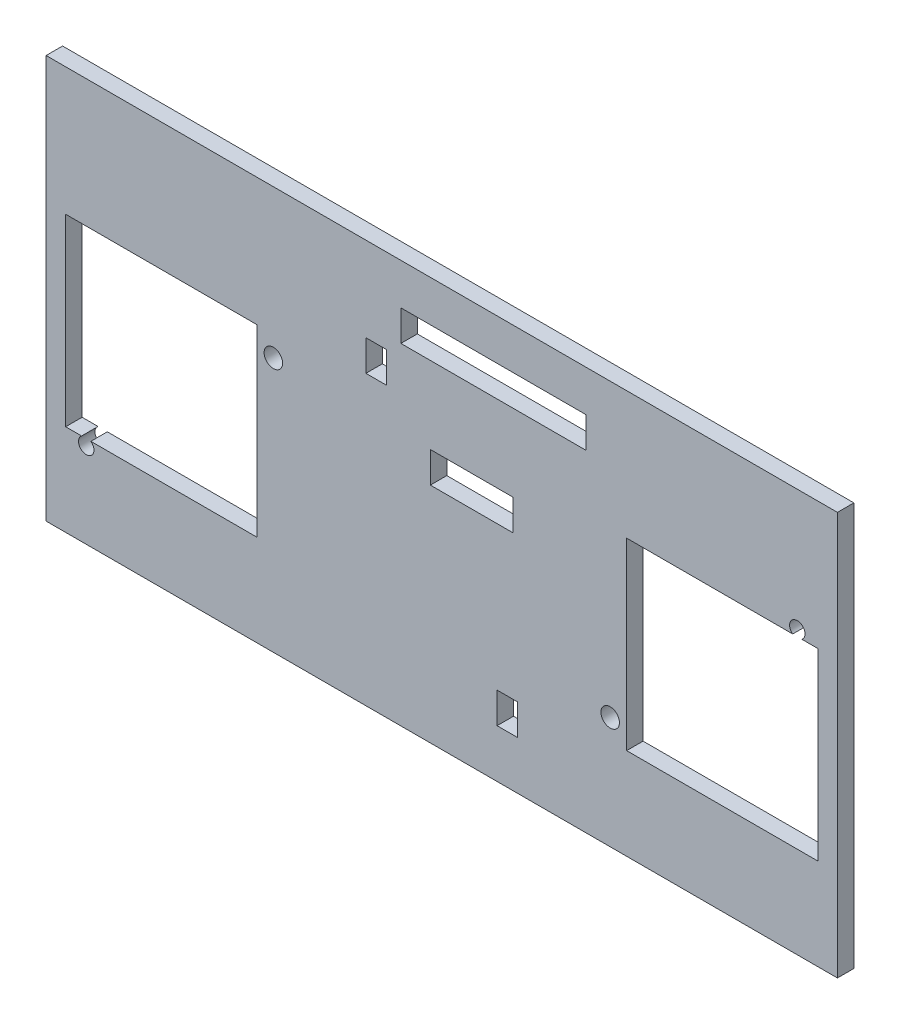
ISO-10303-21;
HEADER;
FILE_DESCRIPTION(('STEP AP214'),'2;1');
FILE_NAME('part.step','',(''),(''),'','','');
FILE_SCHEMA(('AUTOMOTIVE_DESIGN { 1 0 10303 214 1 1 1 1 }'));
ENDSEC;
DATA;
#1=APPLICATION_CONTEXT('core data for automotive mechanical design processes');
#2=APPLICATION_PROTOCOL_DEFINITION('international standard','automotive_design',2000,#1);
#3=PRODUCT_CONTEXT('',#1,'mechanical');
#4=PRODUCT('Part','Part','',(#3));
#5=PRODUCT_RELATED_PRODUCT_CATEGORY('part','',(#4));
#6=PRODUCT_DEFINITION_FORMATION('','',#4);
#7=PRODUCT_DEFINITION_CONTEXT('part definition',#1,'design');
#8=PRODUCT_DEFINITION('design','',#6,#7);
#9=PRODUCT_DEFINITION_SHAPE('','',#8);
#10=(LENGTH_UNIT() NAMED_UNIT(*) SI_UNIT(.MILLI.,.METRE.));
#11=(NAMED_UNIT(*) PLANE_ANGLE_UNIT() SI_UNIT($,.RADIAN.));
#12=(NAMED_UNIT(*) SI_UNIT($,.STERADIAN.) SOLID_ANGLE_UNIT());
#13=UNCERTAINTY_MEASURE_WITH_UNIT(LENGTH_MEASURE(1.E-05),#10,'distance_accuracy_value','');
#14=(GEOMETRIC_REPRESENTATION_CONTEXT(3) GLOBAL_UNCERTAINTY_ASSIGNED_CONTEXT((#13)) GLOBAL_UNIT_ASSIGNED_CONTEXT((#10,
#11,#12)) REPRESENTATION_CONTEXT('',''));
#15=CARTESIAN_POINT('',(0.,0.,0.));
#16=DIRECTION('',(0.,0.,1.));
#17=DIRECTION('',(1.,0.,0.));
#18=AXIS2_PLACEMENT_3D('',#15,#16,#17);
#19=CARTESIAN_POINT('',(-36.58,-9.71,1.6));
#20=DIRECTION('',(0.,1.,0.));
#21=DIRECTION('',(0.,0.,1.));
#22=AXIS2_PLACEMENT_3D('',#19,#20,#21);
#23=PLANE('',#22);
#24=DIRECTION('',(0.,0.,1.));
#25=VECTOR('',#24,1.);
#26=CARTESIAN_POINT('',(-35.03,-9.71,0.));
#27=LINE('',#26,#25);
#28=CARTESIAN_POINT('',(-35.03,-9.71,0.));
#29=VERTEX_POINT('',#28);
#30=CARTESIAN_POINT('',(-35.03,-9.71,1.6));
#31=VERTEX_POINT('',#30);
#32=EDGE_CURVE('E500',#29,#31,#27,.T.);
#33=ORIENTED_EDGE('',*,*,#32,.F.);
#34=DIRECTION('',(1.,0.,0.));
#35=VECTOR('',#34,1.);
#36=CARTESIAN_POINT('',(-36.58,-9.71,0.));
#37=LINE('',#36,#35);
#38=CARTESIAN_POINT('',(-36.58,-9.71,0.));
#39=VERTEX_POINT('',#38);
#40=EDGE_CURVE('E415',#39,#29,#37,.T.);
#41=ORIENTED_EDGE('',*,*,#40,.F.);
#42=DIRECTION('',(0.,0.,-1.));
#43=VECTOR('',#42,1.);
#44=CARTESIAN_POINT('',(-36.58,-9.71,1.6));
#45=LINE('',#44,#43);
#46=CARTESIAN_POINT('',(-36.58,-9.71,1.6));
#47=VERTEX_POINT('',#46);
#48=EDGE_CURVE('E430',#47,#39,#45,.T.);
#49=ORIENTED_EDGE('',*,*,#48,.F.);
#50=DIRECTION('',(1.,0.,0.));
#51=VECTOR('',#50,1.);
#52=CARTESIAN_POINT('',(-36.58,-9.71,1.6));
#53=LINE('',#52,#51);
#54=EDGE_CURVE('E403',#47,#31,#53,.T.);
#55=ORIENTED_EDGE('',*,*,#54,.T.);
#56=EDGE_LOOP('',(#33,#41,#49,#55));
#57=FACE_BOUND('',#56,.T.);
#58=ADVANCED_FACE('F41',(#57),#23,.T.);
#59=CARTESIAN_POINT('',(17.9799999999997,8.18999999999984,1.6));
#60=DIRECTION('',(0.,-1.,0.));
#61=DIRECTION('',(0.,0.,-1.));
#62=AXIS2_PLACEMENT_3D('',#59,#60,#61);
#63=PLANE('',#62);
#64=DIRECTION('',(0.,0.,1.));
#65=VECTOR('',#64,1.);
#66=CARTESIAN_POINT('',(35.0300000000002,8.18999999999984,0.));
#67=LINE('',#66,#65);
#68=CARTESIAN_POINT('',(35.0300000000002,8.18999999999984,0.));
#69=VERTEX_POINT('',#68);
#70=CARTESIAN_POINT('',(35.0300000000002,8.18999999999984,1.6));
#71=VERTEX_POINT('',#70);
#72=EDGE_CURVE('E496',#69,#71,#67,.T.);
#73=ORIENTED_EDGE('',*,*,#72,.F.);
#74=DIRECTION('',(-1.,0.,0.));
#75=VECTOR('',#74,1.);
#76=CARTESIAN_POINT('',(17.9799999999997,8.18999999999984,0.));
#77=LINE('',#76,#75);
#78=CARTESIAN_POINT('',(36.5799999999999,8.18999999999984,0.));
#79=VERTEX_POINT('',#78);
#80=EDGE_CURVE('E368',#79,#69,#77,.T.);
#81=ORIENTED_EDGE('',*,*,#80,.F.);
#82=DIRECTION('',(0.,0.,-1.));
#83=VECTOR('',#82,1.);
#84=CARTESIAN_POINT('',(36.5799999999999,8.18999999999984,1.6));
#85=LINE('',#84,#83);
#86=CARTESIAN_POINT('',(36.5799999999999,8.18999999999984,1.6));
#87=VERTEX_POINT('',#86);
#88=EDGE_CURVE('E391',#87,#79,#85,.T.);
#89=ORIENTED_EDGE('',*,*,#88,.F.);
#90=DIRECTION('',(-1.,0.,0.));
#91=VECTOR('',#90,1.);
#92=CARTESIAN_POINT('',(17.9799999999997,8.18999999999984,1.6));
#93=LINE('',#92,#91);
#94=EDGE_CURVE('E374',#87,#71,#93,.T.);
#95=ORIENTED_EDGE('',*,*,#94,.T.);
#96=EDGE_LOOP('',(#73,#81,#89,#95));
#97=FACE_BOUND('',#96,.T.);
#98=ADVANCED_FACE('F527',(#97),#63,.T.);
#99=CARTESIAN_POINT('',(0.,0.,1.6));
#100=DIRECTION('',(0.,0.,1.));
#101=DIRECTION('',(1.,0.,0.));
#102=AXIS2_PLACEMENT_3D('',#99,#100,#101);
#103=PLANE('',#102);
#104=DIRECTION('',(0.,1.,0.));
#105=VECTOR('',#104,1.);
#106=CARTESIAN_POINT('',(6.94,3.11,1.6));
#107=LINE('',#106,#105);
#108=CARTESIAN_POINT('',(6.94,3.11,1.6));
#109=VERTEX_POINT('',#108);
#110=CARTESIAN_POINT('',(6.94,6.11,1.6));
#111=VERTEX_POINT('',#110);
#112=EDGE_CURVE('E56',#109,#111,#107,.T.);
#113=ORIENTED_EDGE('',*,*,#112,.F.);
#114=DIRECTION('',(1.,0.,0.));
#115=VECTOR('',#114,1.);
#116=CARTESIAN_POINT('',(6.94,3.11,1.6));
#117=LINE('',#116,#115);
#118=CARTESIAN_POINT('',(-1.10999999999999,3.11,1.6));
#119=VERTEX_POINT('',#118);
#120=EDGE_CURVE('E269',#119,#109,#117,.T.);
#121=ORIENTED_EDGE('',*,*,#120,.F.);
#122=DIRECTION('',(0.,-1.,0.));
#123=VECTOR('',#122,1.);
#124=CARTESIAN_POINT('',(-1.10999999999999,3.11,1.6));
#125=LINE('',#124,#123);
#126=CARTESIAN_POINT('',(-1.10999999999999,6.11,1.6));
#127=VERTEX_POINT('',#126);
#128=EDGE_CURVE('E253',#127,#119,#125,.T.);
#129=ORIENTED_EDGE('',*,*,#128,.F.);
#130=DIRECTION('',(-1.,0.,0.));
#131=VECTOR('',#130,1.);
#132=CARTESIAN_POINT('',(6.94,6.11,1.6));
#133=LINE('',#132,#131);
#134=EDGE_CURVE('E262',#111,#127,#133,.T.);
#135=ORIENTED_EDGE('',*,*,#134,.F.);
#136=EDGE_LOOP('',(#113,#121,#129,#135));
#137=FACE_BOUND('',#136,.T.);
#138=DIRECTION('',(0.,1.,0.));
#139=VECTOR('',#138,1.);
#140=CARTESIAN_POINT('',(7.37999999999971,-13.91,1.6));
#141=LINE('',#140,#139);
#142=CARTESIAN_POINT('',(7.37999999999971,-13.91,1.6));
#143=VERTEX_POINT('',#142);
#144=CARTESIAN_POINT('',(7.37999999999971,-10.91,1.6));
#145=VERTEX_POINT('',#144);
#146=EDGE_CURVE('E293',#143,#145,#141,.T.);
#147=ORIENTED_EDGE('',*,*,#146,.F.);
#148=DIRECTION('',(1.,0.,0.));
#149=VECTOR('',#148,1.);
#150=CARTESIAN_POINT('',(7.37999999999971,-13.91,1.6));
#151=LINE('',#150,#149);
#152=CARTESIAN_POINT('',(5.37999999999971,-13.91,1.6));
#153=VERTEX_POINT('',#152);
#154=EDGE_CURVE('E283',#153,#143,#151,.T.);
#155=ORIENTED_EDGE('',*,*,#154,.F.);
#156=DIRECTION('',(0.,-1.,0.));
#157=VECTOR('',#156,1.);
#158=CARTESIAN_POINT('',(5.37999999999971,-13.91,1.6));
#159=LINE('',#158,#157);
#160=CARTESIAN_POINT('',(5.37999999999971,-10.91,1.6));
#161=VERTEX_POINT('',#160);
#162=EDGE_CURVE('E299',#161,#153,#159,.T.);
#163=ORIENTED_EDGE('',*,*,#162,.F.);
#164=DIRECTION('',(-1.,0.,0.));
#165=VECTOR('',#164,1.);
#166=CARTESIAN_POINT('',(7.37999999999971,-10.91,1.6));
#167=LINE('',#166,#165);
#168=EDGE_CURVE('E295',#145,#161,#167,.T.);
#169=ORIENTED_EDGE('',*,*,#168,.F.);
#170=EDGE_LOOP('',(#147,#155,#163,#169));
#171=FACE_BOUND('',#170,.T.);
#172=DIRECTION('',(0.,1.,0.));
#173=VECTOR('',#172,1.);
#174=CARTESIAN_POINT('',(-5.38,9.39,1.6));
#175=LINE('',#174,#173);
#176=CARTESIAN_POINT('',(-5.38,9.39,1.6));
#177=VERTEX_POINT('',#176);
#178=CARTESIAN_POINT('',(-5.38,12.39,1.6));
#179=VERTEX_POINT('',#178);
#180=EDGE_CURVE('E296',#177,#179,#175,.T.);
#181=ORIENTED_EDGE('',*,*,#180,.F.);
#182=DIRECTION('',(1.,0.,0.));
#183=VECTOR('',#182,1.);
#184=CARTESIAN_POINT('',(-5.38,9.39,1.6));
#185=LINE('',#184,#183);
#186=CARTESIAN_POINT('',(-7.38,9.39,1.6));
#187=VERTEX_POINT('',#186);
#188=EDGE_CURVE('E322',#187,#177,#185,.T.);
#189=ORIENTED_EDGE('',*,*,#188,.F.);
#190=DIRECTION('',(0.,-1.,0.));
#191=VECTOR('',#190,1.);
#192=CARTESIAN_POINT('',(-7.38,9.39,1.6));
#193=LINE('',#192,#191);
#194=CARTESIAN_POINT('',(-7.38,12.39,1.6));
#195=VERTEX_POINT('',#194);
#196=EDGE_CURVE('E325',#195,#187,#193,.T.);
#197=ORIENTED_EDGE('',*,*,#196,.F.);
#198=DIRECTION('',(-1.,0.,0.));
#199=VECTOR('',#198,1.);
#200=CARTESIAN_POINT('',(-5.38,12.39,1.6));
#201=LINE('',#200,#199);
#202=EDGE_CURVE('E329',#179,#195,#201,.T.);
#203=ORIENTED_EDGE('',*,*,#202,.F.);
#204=EDGE_LOOP('',(#181,#189,#197,#203));
#205=FACE_BOUND('',#204,.T.);
#206=CARTESIAN_POINT('',(34.5799999999999,8.78999999999967,1.6));
#207=DIRECTION('',(0.,0.,1.));
#208=DIRECTION('',(1.,0.,0.));
#209=AXIS2_PLACEMENT_3D('',#206,#207,#208);
#210=CIRCLE('',#209,0.749999999999999);
#211=CARTESIAN_POINT('',(34.1299999999997,8.18999999999984,1.6));
#212=VERTEX_POINT('',#211);
#213=EDGE_CURVE('E347',#71,#212,#210,.T.);
#214=ORIENTED_EDGE('',*,*,#213,.F.);
#215=ORIENTED_EDGE('',*,*,#94,.F.);
#216=DIRECTION('',(0.,1.,0.));
#217=VECTOR('',#216,1.);
#218=CARTESIAN_POINT('',(36.5799999999999,8.18999999999984,1.6));
#219=LINE('',#218,#217);
#220=CARTESIAN_POINT('',(36.5799999999999,-9.71000000000036,1.6));
#221=VERTEX_POINT('',#220);
#222=EDGE_CURVE('E370',#221,#87,#219,.T.);
#223=ORIENTED_EDGE('',*,*,#222,.F.);
#224=DIRECTION('',(1.,0.,0.));
#225=VECTOR('',#224,1.);
#226=CARTESIAN_POINT('',(17.9799999999997,-9.71000000000036,1.6));
#227=LINE('',#226,#225);
#228=CARTESIAN_POINT('',(17.9799999999997,-9.71000000000036,1.6));
#229=VERTEX_POINT('',#228);
#230=EDGE_CURVE('E367',#229,#221,#227,.T.);
#231=ORIENTED_EDGE('',*,*,#230,.F.);
#232=DIRECTION('',(0.,-1.,0.));
#233=VECTOR('',#232,1.);
#234=CARTESIAN_POINT('',(17.9799999999997,8.18999999999984,1.6));
#235=LINE('',#234,#233);
#236=CARTESIAN_POINT('',(17.9799999999997,8.18999999999984,1.6));
#237=VERTEX_POINT('',#236);
#238=EDGE_CURVE('E365',#237,#229,#235,.T.);
#239=ORIENTED_EDGE('',*,*,#238,.F.);
#240=EDGE_CURVE('E373',#212,#237,#93,.T.);
#241=ORIENTED_EDGE('',*,*,#240,.F.);
#242=EDGE_LOOP('',(#214,#215,#223,#231,#239,#241));
#243=FACE_BOUND('',#242,.T.);
#244=CARTESIAN_POINT('',(-34.58,-10.31,1.6));
#245=DIRECTION('',(0.,0.,1.));
#246=DIRECTION('',(1.,0.,0.));
#247=AXIS2_PLACEMENT_3D('',#244,#245,#246);
#248=CIRCLE('',#247,0.749999999999999);
#249=CARTESIAN_POINT('',(-34.13,-9.71,1.6));
#250=VERTEX_POINT('',#249);
#251=EDGE_CURVE('E349',#31,#250,#248,.T.);
#252=ORIENTED_EDGE('',*,*,#251,.F.);
#253=ORIENTED_EDGE('',*,*,#54,.F.);
#254=DIRECTION('',(0.,-1.,0.));
#255=VECTOR('',#254,1.);
#256=CARTESIAN_POINT('',(-36.58,8.19,1.6));
#257=LINE('',#256,#255);
#258=CARTESIAN_POINT('',(-36.58,8.19,1.6));
#259=VERTEX_POINT('',#258);
#260=EDGE_CURVE('E399',#259,#47,#257,.T.);
#261=ORIENTED_EDGE('',*,*,#260,.F.);
#262=DIRECTION('',(-1.,0.,0.));
#263=VECTOR('',#262,1.);
#264=CARTESIAN_POINT('',(-36.58,8.19,1.6));
#265=LINE('',#264,#263);
#266=CARTESIAN_POINT('',(-17.98,8.19,1.6));
#267=VERTEX_POINT('',#266);
#268=EDGE_CURVE('E409',#267,#259,#265,.T.);
#269=ORIENTED_EDGE('',*,*,#268,.F.);
#270=DIRECTION('',(0.,1.,0.));
#271=VECTOR('',#270,1.);
#272=CARTESIAN_POINT('',(-17.98,8.19,1.6));
#273=LINE('',#272,#271);
#274=CARTESIAN_POINT('',(-17.98,-9.71,1.6));
#275=VERTEX_POINT('',#274);
#276=EDGE_CURVE('E406',#275,#267,#273,.T.);
#277=ORIENTED_EDGE('',*,*,#276,.F.);
#278=EDGE_CURVE('E401',#250,#275,#53,.T.);
#279=ORIENTED_EDGE('',*,*,#278,.F.);
#280=EDGE_LOOP('',(#252,#253,#261,#269,#277,#279));
#281=FACE_BOUND('',#280,.T.);
#282=CARTESIAN_POINT('',(-16.38,6.19,1.6));
#283=DIRECTION('',(0.,0.,1.));
#284=DIRECTION('',(1.,0.,0.));
#285=AXIS2_PLACEMENT_3D('',#282,#283,#284);
#286=CIRCLE('',#285,0.9);
#287=CARTESIAN_POINT('',(-15.48,6.19,1.6));
#288=VERTEX_POINT('',#287);
#289=EDGE_CURVE('E359',#288,#288,#286,.T.);
#290=ORIENTED_EDGE('',*,*,#289,.F.);
#291=EDGE_LOOP('',(#290));
#292=FACE_BOUND('',#291,.T.);
#293=DIRECTION('',(0.,1.,0.));
#294=VECTOR('',#293,1.);
#295=CARTESIAN_POINT('',(38.4799999999999,-18.61,1.6));
#296=LINE('',#295,#294);
#297=CARTESIAN_POINT('',(38.4799999999999,-18.61,1.6));
#298=VERTEX_POINT('',#297);
#299=CARTESIAN_POINT('',(38.4799999999999,20.61,1.6));
#300=VERTEX_POINT('',#299);
#301=EDGE_CURVE('E465',#298,#300,#296,.T.);
#302=ORIENTED_EDGE('',*,*,#301,.T.);
#303=DIRECTION('',(-1.,0.,0.));
#304=VECTOR('',#303,1.);
#305=CARTESIAN_POINT('',(38.4799999999999,20.61,1.6));
#306=LINE('',#305,#304);
#307=CARTESIAN_POINT('',(-38.48,20.61,1.6));
#308=VERTEX_POINT('',#307);
#309=EDGE_CURVE('E468',#300,#308,#306,.T.);
#310=ORIENTED_EDGE('',*,*,#309,.T.);
#311=DIRECTION('',(0.,-1.,0.));
#312=VECTOR('',#311,1.);
#313=CARTESIAN_POINT('',(-38.48,-18.61,1.6));
#314=LINE('',#313,#312);
#315=CARTESIAN_POINT('',(-38.48,-18.61,1.6));
#316=VERTEX_POINT('',#315);
#317=EDGE_CURVE('E471',#308,#316,#314,.T.);
#318=ORIENTED_EDGE('',*,*,#317,.T.);
#319=DIRECTION('',(1.,0.,0.));
#320=VECTOR('',#319,1.);
#321=CARTESIAN_POINT('',(38.4799999999999,-18.61,1.6));
#322=LINE('',#321,#320);
#323=EDGE_CURVE('E473',#316,#298,#322,.T.);
#324=ORIENTED_EDGE('',*,*,#323,.T.);
#325=EDGE_LOOP('',(#302,#310,#318,#324));
#326=FACE_BOUND('',#325,.T.);
#327=DIRECTION('',(1.,0.,0.));
#328=VECTOR('',#327,1.);
#329=CARTESIAN_POINT('',(-3.98,13.61,1.6));
#330=LINE('',#329,#328);
#331=CARTESIAN_POINT('',(-3.98,13.61,1.6));
#332=VERTEX_POINT('',#331);
#333=CARTESIAN_POINT('',(14.02,13.61,1.6));
#334=VERTEX_POINT('',#333);
#335=EDGE_CURVE('E436',#332,#334,#330,.T.);
#336=ORIENTED_EDGE('',*,*,#335,.F.);
#337=DIRECTION('',(0.,-1.,0.));
#338=VECTOR('',#337,1.);
#339=CARTESIAN_POINT('',(-3.98,16.61,1.6));
#340=LINE('',#339,#338);
#341=CARTESIAN_POINT('',(-3.98,16.61,1.6));
#342=VERTEX_POINT('',#341);
#343=EDGE_CURVE('E434',#342,#332,#340,.T.);
#344=ORIENTED_EDGE('',*,*,#343,.F.);
#345=DIRECTION('',(-1.,0.,0.));
#346=VECTOR('',#345,1.);
#347=CARTESIAN_POINT('',(-3.98,16.61,1.6));
#348=LINE('',#347,#346);
#349=CARTESIAN_POINT('',(14.02,16.61,1.6));
#350=VERTEX_POINT('',#349);
#351=EDGE_CURVE('E442',#350,#342,#348,.T.);
#352=ORIENTED_EDGE('',*,*,#351,.F.);
#353=DIRECTION('',(0.,1.,0.));
#354=VECTOR('',#353,1.);
#355=CARTESIAN_POINT('',(14.02,16.61,1.6));
#356=LINE('',#355,#354);
#357=EDGE_CURVE('E439',#334,#350,#356,.T.);
#358=ORIENTED_EDGE('',*,*,#357,.F.);
#359=EDGE_LOOP('',(#336,#344,#352,#358));
#360=FACE_BOUND('',#359,.T.);
#361=CARTESIAN_POINT('',(16.3799999999997,-7.71000000000014,1.6));
#362=DIRECTION('',(0.,0.,1.));
#363=DIRECTION('',(1.,0.,0.));
#364=AXIS2_PLACEMENT_3D('',#361,#362,#363);
#365=CIRCLE('',#364,0.9);
#366=CARTESIAN_POINT('',(17.2799999999997,-7.71000000000014,1.6));
#367=VERTEX_POINT('',#366);
#368=EDGE_CURVE('E353',#367,#367,#365,.T.);
#369=ORIENTED_EDGE('',*,*,#368,.F.);
#370=EDGE_LOOP('',(#369));
#371=FACE_BOUND('',#370,.T.);
#372=ADVANCED_FACE('F266',(#137,#171,#205,#243,#281,#292,#326,#360,#371),#103,.T.);
#373=CARTESIAN_POINT('',(0.,0.,0.));
#374=DIRECTION('',(0.,0.,1.));
#375=DIRECTION('',(1.,0.,0.));
#376=AXIS2_PLACEMENT_3D('',#373,#374,#375);
#377=PLANE('',#376);
#378=DIRECTION('',(1.,0.,0.));
#379=VECTOR('',#378,1.);
#380=CARTESIAN_POINT('',(0.,3.11,0.));
#381=LINE('',#380,#379);
#382=CARTESIAN_POINT('',(-1.10999999999999,3.11,0.));
#383=VERTEX_POINT('',#382);
#384=CARTESIAN_POINT('',(6.94,3.11,0.));
#385=VERTEX_POINT('',#384);
#386=EDGE_CURVE('E49',#383,#385,#381,.T.);
#387=ORIENTED_EDGE('',*,*,#386,.T.);
#388=DIRECTION('',(0.,1.,0.));
#389=VECTOR('',#388,1.);
#390=CARTESIAN_POINT('',(6.94,0.,0.));
#391=LINE('',#390,#389);
#392=CARTESIAN_POINT('',(6.94,6.11,0.));
#393=VERTEX_POINT('',#392);
#394=EDGE_CURVE('E11',#385,#393,#391,.T.);
#395=ORIENTED_EDGE('',*,*,#394,.T.);
#396=DIRECTION('',(-1.,0.,0.));
#397=VECTOR('',#396,1.);
#398=CARTESIAN_POINT('',(0.,6.11,0.));
#399=LINE('',#398,#397);
#400=CARTESIAN_POINT('',(-1.10999999999999,6.11,0.));
#401=VERTEX_POINT('',#400);
#402=EDGE_CURVE('E502',#393,#401,#399,.T.);
#403=ORIENTED_EDGE('',*,*,#402,.T.);
#404=DIRECTION('',(0.,-1.,0.));
#405=VECTOR('',#404,1.);
#406=CARTESIAN_POINT('',(-1.10999999999999,0.,0.));
#407=LINE('',#406,#405);
#408=EDGE_CURVE('E256',#401,#383,#407,.T.);
#409=ORIENTED_EDGE('',*,*,#408,.T.);
#410=EDGE_LOOP('',(#387,#395,#403,#409));
#411=FACE_BOUND('',#410,.T.);
#412=DIRECTION('',(1.,0.,0.));
#413=VECTOR('',#412,1.);
#414=CARTESIAN_POINT('',(7.37999999999971,-13.91,0.));
#415=LINE('',#414,#413);
#416=CARTESIAN_POINT('',(5.37999999999971,-13.91,0.));
#417=VERTEX_POINT('',#416);
#418=CARTESIAN_POINT('',(7.37999999999971,-13.91,0.));
#419=VERTEX_POINT('',#418);
#420=EDGE_CURVE('E289',#417,#419,#415,.T.);
#421=ORIENTED_EDGE('',*,*,#420,.T.);
#422=DIRECTION('',(0.,1.,0.));
#423=VECTOR('',#422,1.);
#424=CARTESIAN_POINT('',(7.37999999999971,-13.91,0.));
#425=LINE('',#424,#423);
#426=CARTESIAN_POINT('',(7.37999999999971,-10.91,0.));
#427=VERTEX_POINT('',#426);
#428=EDGE_CURVE('E279',#419,#427,#425,.T.);
#429=ORIENTED_EDGE('',*,*,#428,.T.);
#430=DIRECTION('',(-1.,0.,0.));
#431=VECTOR('',#430,1.);
#432=CARTESIAN_POINT('',(7.37999999999971,-10.91,0.));
#433=LINE('',#432,#431);
#434=CARTESIAN_POINT('',(5.37999999999971,-10.91,0.));
#435=VERTEX_POINT('',#434);
#436=EDGE_CURVE('E282',#427,#435,#433,.T.);
#437=ORIENTED_EDGE('',*,*,#436,.T.);
#438=DIRECTION('',(0.,-1.,0.));
#439=VECTOR('',#438,1.);
#440=CARTESIAN_POINT('',(5.37999999999971,-13.91,0.));
#441=LINE('',#440,#439);
#442=EDGE_CURVE('E286',#435,#417,#441,.T.);
#443=ORIENTED_EDGE('',*,*,#442,.T.);
#444=EDGE_LOOP('',(#421,#429,#437,#443));
#445=FACE_BOUND('',#444,.T.);
#446=DIRECTION('',(1.,0.,0.));
#447=VECTOR('',#446,1.);
#448=CARTESIAN_POINT('',(-5.38,9.39,0.));
#449=LINE('',#448,#447);
#450=CARTESIAN_POINT('',(-7.38,9.39,0.));
#451=VERTEX_POINT('',#450);
#452=CARTESIAN_POINT('',(-5.38,9.39,0.));
#453=VERTEX_POINT('',#452);
#454=EDGE_CURVE('E316',#451,#453,#449,.T.);
#455=ORIENTED_EDGE('',*,*,#454,.T.);
#456=DIRECTION('',(0.,1.,0.));
#457=VECTOR('',#456,1.);
#458=CARTESIAN_POINT('',(-5.38,9.39,0.));
#459=LINE('',#458,#457);
#460=CARTESIAN_POINT('',(-5.38,12.39,0.));
#461=VERTEX_POINT('',#460);
#462=EDGE_CURVE('E326',#453,#461,#459,.T.);
#463=ORIENTED_EDGE('',*,*,#462,.T.);
#464=DIRECTION('',(-1.,0.,0.));
#465=VECTOR('',#464,1.);
#466=CARTESIAN_POINT('',(-5.38,12.39,0.));
#467=LINE('',#466,#465);
#468=CARTESIAN_POINT('',(-7.38,12.39,0.));
#469=VERTEX_POINT('',#468);
#470=EDGE_CURVE('E338',#461,#469,#467,.T.);
#471=ORIENTED_EDGE('',*,*,#470,.T.);
#472=DIRECTION('',(0.,-1.,0.));
#473=VECTOR('',#472,1.);
#474=CARTESIAN_POINT('',(-7.38,9.39,0.));
#475=LINE('',#474,#473);
#476=EDGE_CURVE('E335',#469,#451,#475,.T.);
#477=ORIENTED_EDGE('',*,*,#476,.T.);
#478=EDGE_LOOP('',(#455,#463,#471,#477));
#479=FACE_BOUND('',#478,.T.);
#480=ORIENTED_EDGE('',*,*,#40,.T.);
#481=CARTESIAN_POINT('',(-34.58,-10.31,0.));
#482=DIRECTION('',(0.,0.,1.));
#483=DIRECTION('',(1.,0.,0.));
#484=AXIS2_PLACEMENT_3D('',#481,#482,#483);
#485=CIRCLE('',#484,0.749999999999999);
#486=CARTESIAN_POINT('',(-34.13,-9.71,0.));
#487=VERTEX_POINT('',#486);
#488=EDGE_CURVE('E306',#29,#487,#485,.T.);
#489=ORIENTED_EDGE('',*,*,#488,.T.);
#490=CARTESIAN_POINT('',(-17.98,-9.71,0.));
#491=VERTEX_POINT('',#490);
#492=EDGE_CURVE('E414',#487,#491,#37,.T.);
#493=ORIENTED_EDGE('',*,*,#492,.T.);
#494=DIRECTION('',(0.,1.,0.));
#495=VECTOR('',#494,1.);
#496=CARTESIAN_POINT('',(-17.98,8.19,0.));
#497=LINE('',#496,#495);
#498=CARTESIAN_POINT('',(-17.98,8.19,0.));
#499=VERTEX_POINT('',#498);
#500=EDGE_CURVE('E418',#491,#499,#497,.T.);
#501=ORIENTED_EDGE('',*,*,#500,.T.);
#502=DIRECTION('',(-1.,0.,0.));
#503=VECTOR('',#502,1.);
#504=CARTESIAN_POINT('',(-36.58,8.19,0.));
#505=LINE('',#504,#503);
#506=CARTESIAN_POINT('',(-36.58,8.19,0.));
#507=VERTEX_POINT('',#506);
#508=EDGE_CURVE('E402',#499,#507,#505,.T.);
#509=ORIENTED_EDGE('',*,*,#508,.T.);
#510=DIRECTION('',(0.,-1.,0.));
#511=VECTOR('',#510,1.);
#512=CARTESIAN_POINT('',(-36.58,8.19,0.));
#513=LINE('',#512,#511);
#514=EDGE_CURVE('E398',#507,#39,#513,.T.);
#515=ORIENTED_EDGE('',*,*,#514,.T.);
#516=EDGE_LOOP('',(#480,#489,#493,#501,#509,#515));
#517=FACE_BOUND('',#516,.T.);
#518=DIRECTION('',(0.,1.,0.));
#519=VECTOR('',#518,1.);
#520=CARTESIAN_POINT('',(38.4799999999999,-18.61,0.));
#521=LINE('',#520,#519);
#522=CARTESIAN_POINT('',(38.4799999999999,-18.61,0.));
#523=VERTEX_POINT('',#522);
#524=CARTESIAN_POINT('',(38.4799999999999,20.61,0.));
#525=VERTEX_POINT('',#524);
#526=EDGE_CURVE('E464',#523,#525,#521,.T.);
#527=ORIENTED_EDGE('',*,*,#526,.F.);
#528=DIRECTION('',(1.,0.,0.));
#529=VECTOR('',#528,1.);
#530=CARTESIAN_POINT('',(38.4799999999999,-18.61,0.));
#531=LINE('',#530,#529);
#532=CARTESIAN_POINT('',(-38.48,-18.61,0.));
#533=VERTEX_POINT('',#532);
#534=EDGE_CURVE('E469',#533,#523,#531,.T.);
#535=ORIENTED_EDGE('',*,*,#534,.F.);
#536=DIRECTION('',(0.,-1.,0.));
#537=VECTOR('',#536,1.);
#538=CARTESIAN_POINT('',(-38.48,-18.61,0.));
#539=LINE('',#538,#537);
#540=CARTESIAN_POINT('',(-38.48,20.61,0.));
#541=VERTEX_POINT('',#540);
#542=EDGE_CURVE('E480',#541,#533,#539,.T.);
#543=ORIENTED_EDGE('',*,*,#542,.F.);
#544=DIRECTION('',(-1.,0.,0.));
#545=VECTOR('',#544,1.);
#546=CARTESIAN_POINT('',(38.4799999999999,20.61,0.));
#547=LINE('',#546,#545);
#548=EDGE_CURVE('E478',#525,#541,#547,.T.);
#549=ORIENTED_EDGE('',*,*,#548,.F.);
#550=EDGE_LOOP('',(#527,#535,#543,#549));
#551=FACE_BOUND('',#550,.T.);
#552=DIRECTION('',(0.,-1.,0.));
#553=VECTOR('',#552,1.);
#554=CARTESIAN_POINT('',(-3.98,16.61,0.));
#555=LINE('',#554,#553);
#556=CARTESIAN_POINT('',(-3.98,16.61,0.));
#557=VERTEX_POINT('',#556);
#558=CARTESIAN_POINT('',(-3.98,13.61,0.));
#559=VERTEX_POINT('',#558);
#560=EDGE_CURVE('E433',#557,#559,#555,.T.);
#561=ORIENTED_EDGE('',*,*,#560,.T.);
#562=DIRECTION('',(1.,0.,0.));
#563=VECTOR('',#562,1.);
#564=CARTESIAN_POINT('',(-3.98,13.61,0.));
#565=LINE('',#564,#563);
#566=CARTESIAN_POINT('',(14.02,13.61,0.));
#567=VERTEX_POINT('',#566);
#568=EDGE_CURVE('E447',#559,#567,#565,.T.);
#569=ORIENTED_EDGE('',*,*,#568,.T.);
#570=DIRECTION('',(0.,1.,0.));
#571=VECTOR('',#570,1.);
#572=CARTESIAN_POINT('',(14.02,16.61,0.));
#573=LINE('',#572,#571);
#574=CARTESIAN_POINT('',(14.02,16.61,0.));
#575=VERTEX_POINT('',#574);
#576=EDGE_CURVE('E450',#567,#575,#573,.T.);
#577=ORIENTED_EDGE('',*,*,#576,.T.);
#578=DIRECTION('',(-1.,0.,0.));
#579=VECTOR('',#578,1.);
#580=CARTESIAN_POINT('',(-3.98,16.61,0.));
#581=LINE('',#580,#579);
#582=EDGE_CURVE('E437',#575,#557,#581,.T.);
#583=ORIENTED_EDGE('',*,*,#582,.T.);
#584=EDGE_LOOP('',(#561,#569,#577,#583));
#585=FACE_BOUND('',#584,.T.);
#586=ORIENTED_EDGE('',*,*,#80,.T.);
#587=CARTESIAN_POINT('',(34.5799999999999,8.78999999999967,0.));
#588=DIRECTION('',(0.,0.,1.));
#589=DIRECTION('',(1.,0.,0.));
#590=AXIS2_PLACEMENT_3D('',#587,#588,#589);
#591=CIRCLE('',#590,0.749999999999999);
#592=CARTESIAN_POINT('',(34.1299999999997,8.18999999999984,0.));
#593=VERTEX_POINT('',#592);
#594=EDGE_CURVE('E343',#69,#593,#591,.T.);
#595=ORIENTED_EDGE('',*,*,#594,.T.);
#596=CARTESIAN_POINT('',(17.9799999999997,8.18999999999984,0.));
#597=VERTEX_POINT('',#596);
#598=EDGE_CURVE('E386',#593,#597,#77,.T.);
#599=ORIENTED_EDGE('',*,*,#598,.T.);
#600=DIRECTION('',(0.,-1.,0.));
#601=VECTOR('',#600,1.);
#602=CARTESIAN_POINT('',(17.9799999999997,8.18999999999984,0.));
#603=LINE('',#602,#601);
#604=CARTESIAN_POINT('',(17.9799999999997,-9.71000000000036,0.));
#605=VERTEX_POINT('',#604);
#606=EDGE_CURVE('E362',#597,#605,#603,.T.);
#607=ORIENTED_EDGE('',*,*,#606,.T.);
#608=DIRECTION('',(1.,0.,0.));
#609=VECTOR('',#608,1.);
#610=CARTESIAN_POINT('',(17.9799999999997,-9.71000000000036,0.));
#611=LINE('',#610,#609);
#612=CARTESIAN_POINT('',(36.5799999999999,-9.71000000000036,0.));
#613=VERTEX_POINT('',#612);
#614=EDGE_CURVE('E380',#605,#613,#611,.T.);
#615=ORIENTED_EDGE('',*,*,#614,.T.);
#616=DIRECTION('',(0.,1.,0.));
#617=VECTOR('',#616,1.);
#618=CARTESIAN_POINT('',(36.5799999999999,8.18999999999984,0.));
#619=LINE('',#618,#617);
#620=EDGE_CURVE('E383',#613,#79,#619,.T.);
#621=ORIENTED_EDGE('',*,*,#620,.T.);
#622=EDGE_LOOP('',(#586,#595,#599,#607,#615,#621));
#623=FACE_BOUND('',#622,.T.);
#624=CARTESIAN_POINT('',(-16.38,6.19,0.));
#625=DIRECTION('',(0.,0.,1.));
#626=DIRECTION('',(1.,0.,0.));
#627=AXIS2_PLACEMENT_3D('',#624,#625,#626);
#628=CIRCLE('',#627,0.9);
#629=CARTESIAN_POINT('',(-15.48,6.19,0.));
#630=VERTEX_POINT('',#629);
#631=EDGE_CURVE('E356',#630,#630,#628,.T.);
#632=ORIENTED_EDGE('',*,*,#631,.T.);
#633=EDGE_LOOP('',(#632));
#634=FACE_BOUND('',#633,.T.);
#635=CARTESIAN_POINT('',(16.3799999999997,-7.71000000000014,0.));
#636=DIRECTION('',(0.,0.,1.));
#637=DIRECTION('',(1.,0.,0.));
#638=AXIS2_PLACEMENT_3D('',#635,#636,#637);
#639=CIRCLE('',#638,0.9);
#640=CARTESIAN_POINT('',(17.2799999999997,-7.71000000000014,0.));
#641=VERTEX_POINT('',#640);
#642=EDGE_CURVE('E346',#641,#641,#639,.T.);
#643=ORIENTED_EDGE('',*,*,#642,.T.);
#644=EDGE_LOOP('',(#643));
#645=FACE_BOUND('',#644,.T.);
#646=ADVANCED_FACE('F506',(#411,#445,#479,#517,#551,#585,#623,#634,#645),#377,.F.);
#647=CARTESIAN_POINT('',(38.4799999999999,-18.61,1.6));
#648=DIRECTION('',(-1.,0.,0.));
#649=DIRECTION('',(0.,0.,1.));
#650=AXIS2_PLACEMENT_3D('',#647,#648,#649);
#651=PLANE('',#650);
#652=ORIENTED_EDGE('',*,*,#526,.T.);
#653=DIRECTION('',(0.,0.,-1.));
#654=VECTOR('',#653,1.);
#655=CARTESIAN_POINT('',(38.4799999999999,20.61,1.6));
#656=LINE('',#655,#654);
#657=EDGE_CURVE('E491',#300,#525,#656,.T.);
#658=ORIENTED_EDGE('',*,*,#657,.F.);
#659=ORIENTED_EDGE('',*,*,#301,.F.);
#660=DIRECTION('',(0.,0.,-1.));
#661=VECTOR('',#660,1.);
#662=CARTESIAN_POINT('',(38.4799999999999,-18.61,1.6));
#663=LINE('',#662,#661);
#664=EDGE_CURVE('E475',#298,#523,#663,.T.);
#665=ORIENTED_EDGE('',*,*,#664,.T.);
#666=EDGE_LOOP('',(#652,#658,#659,#665));
#667=FACE_BOUND('',#666,.T.);
#668=ADVANCED_FACE('F43',(#667),#651,.F.);
#669=CARTESIAN_POINT('',(38.4799999999999,20.61,1.6));
#670=DIRECTION('',(0.,-1.,0.));
#671=DIRECTION('',(1.,0.,0.));
#672=AXIS2_PLACEMENT_3D('',#669,#670,#671);
#673=PLANE('',#672);
#674=ORIENTED_EDGE('',*,*,#548,.T.);
#675=DIRECTION('',(0.,0.,-1.));
#676=VECTOR('',#675,1.);
#677=CARTESIAN_POINT('',(-38.48,20.61,1.6));
#678=LINE('',#677,#676);
#679=EDGE_CURVE('E488',#308,#541,#678,.T.);
#680=ORIENTED_EDGE('',*,*,#679,.F.);
#681=ORIENTED_EDGE('',*,*,#309,.F.);
#682=ORIENTED_EDGE('',*,*,#657,.T.);
#683=EDGE_LOOP('',(#674,#680,#681,#682));
#684=FACE_BOUND('',#683,.T.);
#685=ADVANCED_FACE('F688',(#684),#673,.F.);
#686=CARTESIAN_POINT('',(-38.48,-18.61,1.6));
#687=DIRECTION('',(1.,0.,0.));
#688=DIRECTION('',(0.,0.,-1.));
#689=AXIS2_PLACEMENT_3D('',#686,#687,#688);
#690=PLANE('',#689);
#691=ORIENTED_EDGE('',*,*,#542,.T.);
#692=DIRECTION('',(0.,0.,-1.));
#693=VECTOR('',#692,1.);
#694=CARTESIAN_POINT('',(-38.48,-18.61,1.6));
#695=LINE('',#694,#693);
#696=EDGE_CURVE('E485',#316,#533,#695,.T.);
#697=ORIENTED_EDGE('',*,*,#696,.F.);
#698=ORIENTED_EDGE('',*,*,#317,.F.);
#699=ORIENTED_EDGE('',*,*,#679,.T.);
#700=EDGE_LOOP('',(#691,#697,#698,#699));
#701=FACE_BOUND('',#700,.T.);
#702=ADVANCED_FACE('F685',(#701),#690,.F.);
#703=CARTESIAN_POINT('',(38.4799999999999,-18.61,1.6));
#704=DIRECTION('',(0.,1.,0.));
#705=DIRECTION('',(-1.,0.,0.));
#706=AXIS2_PLACEMENT_3D('',#703,#704,#705);
#707=PLANE('',#706);
#708=ORIENTED_EDGE('',*,*,#534,.T.);
#709=ORIENTED_EDGE('',*,*,#664,.F.);
#710=ORIENTED_EDGE('',*,*,#323,.F.);
#711=ORIENTED_EDGE('',*,*,#696,.T.);
#712=EDGE_LOOP('',(#708,#709,#710,#711));
#713=FACE_BOUND('',#712,.T.);
#714=ADVANCED_FACE('F682',(#713),#707,.F.);
#715=CARTESIAN_POINT('',(-3.98,16.61,1.6));
#716=DIRECTION('',(1.,0.,0.));
#717=DIRECTION('',(0.,1.,0.));
#718=AXIS2_PLACEMENT_3D('',#715,#716,#717);
#719=PLANE('',#718);
#720=ORIENTED_EDGE('',*,*,#560,.F.);
#721=DIRECTION('',(0.,0.,-1.));
#722=VECTOR('',#721,1.);
#723=CARTESIAN_POINT('',(-3.98,16.61,1.6));
#724=LINE('',#723,#722);
#725=EDGE_CURVE('E444',#342,#557,#724,.T.);
#726=ORIENTED_EDGE('',*,*,#725,.F.);
#727=ORIENTED_EDGE('',*,*,#343,.T.);
#728=DIRECTION('',(0.,0.,-1.));
#729=VECTOR('',#728,1.);
#730=CARTESIAN_POINT('',(-3.98,13.61,1.6));
#731=LINE('',#730,#729);
#732=EDGE_CURVE('E461',#332,#559,#731,.T.);
#733=ORIENTED_EDGE('',*,*,#732,.T.);
#734=EDGE_LOOP('',(#720,#726,#727,#733));
#735=FACE_BOUND('',#734,.T.);
#736=ADVANCED_FACE('F679',(#735),#719,.T.);
#737=CARTESIAN_POINT('',(-3.98,13.61,1.6));
#738=DIRECTION('',(0.,1.,0.));
#739=DIRECTION('',(0.,0.,1.));
#740=AXIS2_PLACEMENT_3D('',#737,#738,#739);
#741=PLANE('',#740);
#742=ORIENTED_EDGE('',*,*,#568,.F.);
#743=ORIENTED_EDGE('',*,*,#732,.F.);
#744=ORIENTED_EDGE('',*,*,#335,.T.);
#745=DIRECTION('',(0.,0.,-1.));
#746=VECTOR('',#745,1.);
#747=CARTESIAN_POINT('',(14.02,13.61,1.6));
#748=LINE('',#747,#746);
#749=EDGE_CURVE('E459',#334,#567,#748,.T.);
#750=ORIENTED_EDGE('',*,*,#749,.T.);
#751=EDGE_LOOP('',(#742,#743,#744,#750));
#752=FACE_BOUND('',#751,.T.);
#753=ADVANCED_FACE('F718',(#752),#741,.T.);
#754=CARTESIAN_POINT('',(14.02,16.61,1.6));
#755=DIRECTION('',(-1.,0.,0.));
#756=DIRECTION('',(0.,0.,1.));
#757=AXIS2_PLACEMENT_3D('',#754,#755,#756);
#758=PLANE('',#757);
#759=ORIENTED_EDGE('',*,*,#576,.F.);
#760=ORIENTED_EDGE('',*,*,#749,.F.);
#761=ORIENTED_EDGE('',*,*,#357,.T.);
#762=DIRECTION('',(0.,0.,-1.));
#763=VECTOR('',#762,1.);
#764=CARTESIAN_POINT('',(14.02,16.61,1.6));
#765=LINE('',#764,#763);
#766=EDGE_CURVE('E457',#350,#575,#765,.T.);
#767=ORIENTED_EDGE('',*,*,#766,.T.);
#768=EDGE_LOOP('',(#759,#760,#761,#767));
#769=FACE_BOUND('',#768,.T.);
#770=ADVANCED_FACE('F721',(#769),#758,.T.);
#771=CARTESIAN_POINT('',(-3.98,16.61,1.6));
#772=DIRECTION('',(0.,-1.,0.));
#773=DIRECTION('',(0.,0.,-1.));
#774=AXIS2_PLACEMENT_3D('',#771,#772,#773);
#775=PLANE('',#774);
#776=ORIENTED_EDGE('',*,*,#582,.F.);
#777=ORIENTED_EDGE('',*,*,#766,.F.);
#778=ORIENTED_EDGE('',*,*,#351,.T.);
#779=ORIENTED_EDGE('',*,*,#725,.T.);
#780=EDGE_LOOP('',(#776,#777,#778,#779));
#781=FACE_BOUND('',#780,.T.);
#782=ADVANCED_FACE('F552',(#781),#775,.T.);
#783=CARTESIAN_POINT('',(-36.58,8.19,1.6));
#784=DIRECTION('',(1.,0.,0.));
#785=DIRECTION('',(0.,0.,-1.));
#786=AXIS2_PLACEMENT_3D('',#783,#784,#785);
#787=PLANE('',#786);
#788=ORIENTED_EDGE('',*,*,#514,.F.);
#789=DIRECTION('',(0.,0.,-1.));
#790=VECTOR('',#789,1.);
#791=CARTESIAN_POINT('',(-36.58,8.19,1.6));
#792=LINE('',#791,#790);
#793=EDGE_CURVE('E411',#259,#507,#792,.T.);
#794=ORIENTED_EDGE('',*,*,#793,.F.);
#795=ORIENTED_EDGE('',*,*,#260,.T.);
#796=ORIENTED_EDGE('',*,*,#48,.T.);
#797=EDGE_LOOP('',(#788,#794,#795,#796));
#798=FACE_BOUND('',#797,.T.);
#799=ADVANCED_FACE('F543',(#798),#787,.T.);
#800=DIRECTION('',(0.,0.,1.));
#801=VECTOR('',#800,1.);
#802=CARTESIAN_POINT('',(-34.13,-9.71,0.));
#803=LINE('',#802,#801);
#804=EDGE_CURVE('E498',#250,#487,#803,.F.);
#805=ORIENTED_EDGE('',*,*,#804,.F.);
#806=ORIENTED_EDGE('',*,*,#278,.T.);
#807=DIRECTION('',(0.,0.,-1.));
#808=VECTOR('',#807,1.);
#809=CARTESIAN_POINT('',(-17.98,-9.71,1.6));
#810=LINE('',#809,#808);
#811=EDGE_CURVE('E427',#275,#491,#810,.T.);
#812=ORIENTED_EDGE('',*,*,#811,.T.);
#813=ORIENTED_EDGE('',*,*,#492,.F.);
#814=EDGE_LOOP('',(#805,#806,#812,#813));
#815=FACE_BOUND('',#814,.T.);
#816=ADVANCED_FACE('F530',(#815),#23,.T.);
#817=CARTESIAN_POINT('',(-17.98,8.19,1.6));
#818=DIRECTION('',(-1.,0.,0.));
#819=DIRECTION('',(0.,-1.,0.));
#820=AXIS2_PLACEMENT_3D('',#817,#818,#819);
#821=PLANE('',#820);
#822=ORIENTED_EDGE('',*,*,#500,.F.);
#823=ORIENTED_EDGE('',*,*,#811,.F.);
#824=ORIENTED_EDGE('',*,*,#276,.T.);
#825=DIRECTION('',(0.,0.,-1.));
#826=VECTOR('',#825,1.);
#827=CARTESIAN_POINT('',(-17.98,8.19,1.6));
#828=LINE('',#827,#826);
#829=EDGE_CURVE('E425',#267,#499,#828,.T.);
#830=ORIENTED_EDGE('',*,*,#829,.T.);
#831=EDGE_LOOP('',(#822,#823,#824,#830));
#832=FACE_BOUND('',#831,.T.);
#833=ADVANCED_FACE('F542',(#832),#821,.T.);
#834=CARTESIAN_POINT('',(-36.58,8.19,1.6));
#835=DIRECTION('',(0.,-1.,0.));
#836=DIRECTION('',(0.,0.,-1.));
#837=AXIS2_PLACEMENT_3D('',#834,#835,#836);
#838=PLANE('',#837);
#839=ORIENTED_EDGE('',*,*,#508,.F.);
#840=ORIENTED_EDGE('',*,*,#829,.F.);
#841=ORIENTED_EDGE('',*,*,#268,.T.);
#842=ORIENTED_EDGE('',*,*,#793,.T.);
#843=EDGE_LOOP('',(#839,#840,#841,#842));
#844=FACE_BOUND('',#843,.T.);
#845=ADVANCED_FACE('F549',(#844),#838,.T.);
#846=CARTESIAN_POINT('',(17.9799999999997,8.18999999999984,1.6));
#847=DIRECTION('',(1.,0.,0.));
#848=DIRECTION('',(0.,1.,0.));
#849=AXIS2_PLACEMENT_3D('',#846,#847,#848);
#850=PLANE('',#849);
#851=ORIENTED_EDGE('',*,*,#606,.F.);
#852=DIRECTION('',(0.,0.,-1.));
#853=VECTOR('',#852,1.);
#854=CARTESIAN_POINT('',(17.9799999999997,8.18999999999984,1.6));
#855=LINE('',#854,#853);
#856=EDGE_CURVE('E377',#237,#597,#855,.T.);
#857=ORIENTED_EDGE('',*,*,#856,.F.);
#858=ORIENTED_EDGE('',*,*,#238,.T.);
#859=DIRECTION('',(0.,0.,-1.));
#860=VECTOR('',#859,1.);
#861=CARTESIAN_POINT('',(17.9799999999997,-9.71000000000036,1.6));
#862=LINE('',#861,#860);
#863=EDGE_CURVE('E395',#229,#605,#862,.T.);
#864=ORIENTED_EDGE('',*,*,#863,.T.);
#865=EDGE_LOOP('',(#851,#857,#858,#864));
#866=FACE_BOUND('',#865,.T.);
#867=ADVANCED_FACE('F575',(#866),#850,.T.);
#868=CARTESIAN_POINT('',(17.9799999999997,-9.71000000000036,1.6));
#869=DIRECTION('',(0.,1.,0.));
#870=DIRECTION('',(0.,0.,1.));
#871=AXIS2_PLACEMENT_3D('',#868,#869,#870);
#872=PLANE('',#871);
#873=ORIENTED_EDGE('',*,*,#614,.F.);
#874=ORIENTED_EDGE('',*,*,#863,.F.);
#875=ORIENTED_EDGE('',*,*,#230,.T.);
#876=DIRECTION('',(0.,0.,-1.));
#877=VECTOR('',#876,1.);
#878=CARTESIAN_POINT('',(36.5799999999999,-9.71000000000036,1.6));
#879=LINE('',#878,#877);
#880=EDGE_CURVE('E393',#221,#613,#879,.T.);
#881=ORIENTED_EDGE('',*,*,#880,.T.);
#882=EDGE_LOOP('',(#873,#874,#875,#881));
#883=FACE_BOUND('',#882,.T.);
#884=ADVANCED_FACE('F580',(#883),#872,.T.);
#885=CARTESIAN_POINT('',(36.5799999999999,8.18999999999984,1.6));
#886=DIRECTION('',(-1.,0.,0.));
#887=DIRECTION('',(0.,0.,1.));
#888=AXIS2_PLACEMENT_3D('',#885,#886,#887);
#889=PLANE('',#888);
#890=ORIENTED_EDGE('',*,*,#620,.F.);
#891=ORIENTED_EDGE('',*,*,#880,.F.);
#892=ORIENTED_EDGE('',*,*,#222,.T.);
#893=ORIENTED_EDGE('',*,*,#88,.T.);
#894=EDGE_LOOP('',(#890,#891,#892,#893));
#895=FACE_BOUND('',#894,.T.);
#896=ADVANCED_FACE('F586',(#895),#889,.T.);
#897=DIRECTION('',(0.,0.,1.));
#898=VECTOR('',#897,1.);
#899=CARTESIAN_POINT('',(34.1299999999997,8.18999999999984,0.));
#900=LINE('',#899,#898);
#901=EDGE_CURVE('E494',#212,#593,#900,.F.);
#902=ORIENTED_EDGE('',*,*,#901,.F.);
#903=ORIENTED_EDGE('',*,*,#240,.T.);
#904=ORIENTED_EDGE('',*,*,#856,.T.);
#905=ORIENTED_EDGE('',*,*,#598,.F.);
#906=EDGE_LOOP('',(#902,#903,#904,#905));
#907=FACE_BOUND('',#906,.T.);
#908=ADVANCED_FACE('F537',(#907),#63,.T.);
#909=CARTESIAN_POINT('',(-16.38,6.19,1.6));
#910=DIRECTION('',(0.,0.,-1.));
#911=DIRECTION('',(-1.,0.,0.));
#912=AXIS2_PLACEMENT_3D('',#909,#910,#911);
#913=CYLINDRICAL_SURFACE('',#912,0.9);
#914=ORIENTED_EDGE('',*,*,#289,.T.);
#915=EDGE_LOOP('',(#914));
#916=FACE_BOUND('',#915,.T.);
#917=ORIENTED_EDGE('',*,*,#631,.F.);
#918=EDGE_LOOP('',(#917));
#919=FACE_BOUND('',#918,.T.);
#920=ADVANCED_FACE('F591',(#916,#919),#913,.F.);
#921=CARTESIAN_POINT('',(16.3799999999997,-7.71000000000014,1.6));
#922=DIRECTION('',(0.,0.,-1.));
#923=DIRECTION('',(-1.,0.,0.));
#924=AXIS2_PLACEMENT_3D('',#921,#922,#923);
#925=CYLINDRICAL_SURFACE('',#924,0.9);
#926=ORIENTED_EDGE('',*,*,#368,.T.);
#927=EDGE_LOOP('',(#926));
#928=FACE_BOUND('',#927,.T.);
#929=ORIENTED_EDGE('',*,*,#642,.F.);
#930=EDGE_LOOP('',(#929));
#931=FACE_BOUND('',#930,.T.);
#932=ADVANCED_FACE('F595',(#928,#931),#925,.F.);
#933=CARTESIAN_POINT('',(34.5799999999999,8.78999999999967,0.));
#934=DIRECTION('',(0.,0.,1.));
#935=DIRECTION('',(1.,0.,0.));
#936=AXIS2_PLACEMENT_3D('',#933,#934,#935);
#937=CYLINDRICAL_SURFACE('',#936,0.749999999999999);
#938=ORIENTED_EDGE('',*,*,#72,.T.);
#939=ORIENTED_EDGE('',*,*,#213,.T.);
#940=ORIENTED_EDGE('',*,*,#901,.T.);
#941=ORIENTED_EDGE('',*,*,#594,.F.);
#942=EDGE_LOOP('',(#938,#939,#940,#941));
#943=FACE_BOUND('',#942,.T.);
#944=ADVANCED_FACE('F598',(#943),#937,.F.);
#945=CARTESIAN_POINT('',(-34.58,-10.31,0.));
#946=DIRECTION('',(0.,0.,1.));
#947=DIRECTION('',(1.,0.,0.));
#948=AXIS2_PLACEMENT_3D('',#945,#946,#947);
#949=CYLINDRICAL_SURFACE('',#948,0.749999999999999);
#950=ORIENTED_EDGE('',*,*,#32,.T.);
#951=ORIENTED_EDGE('',*,*,#251,.T.);
#952=ORIENTED_EDGE('',*,*,#804,.T.);
#953=ORIENTED_EDGE('',*,*,#488,.F.);
#954=EDGE_LOOP('',(#950,#951,#952,#953));
#955=FACE_BOUND('',#954,.T.);
#956=ADVANCED_FACE('F570',(#955),#949,.F.);
#957=CARTESIAN_POINT('',(-5.38,9.39,0.));
#958=DIRECTION('',(1.,0.,0.));
#959=DIRECTION('',(0.,0.,-1.));
#960=AXIS2_PLACEMENT_3D('',#957,#958,#959);
#961=PLANE('',#960);
#962=ORIENTED_EDGE('',*,*,#180,.T.);
#963=DIRECTION('',(0.,0.,1.));
#964=VECTOR('',#963,1.);
#965=CARTESIAN_POINT('',(-5.38,12.39,0.));
#966=LINE('',#965,#964);
#967=EDGE_CURVE('E313',#461,#179,#966,.T.);
#968=ORIENTED_EDGE('',*,*,#967,.F.);
#969=ORIENTED_EDGE('',*,*,#462,.F.);
#970=DIRECTION('',(0.,0.,1.));
#971=VECTOR('',#970,1.);
#972=CARTESIAN_POINT('',(-5.38,9.39,0.));
#973=LINE('',#972,#971);
#974=EDGE_CURVE('E276',#453,#177,#973,.T.);
#975=ORIENTED_EDGE('',*,*,#974,.T.);
#976=EDGE_LOOP('',(#962,#968,#969,#975));
#977=FACE_BOUND('',#976,.T.);
#978=ADVANCED_FACE('F602',(#977),#961,.F.);
#979=CARTESIAN_POINT('',(-5.38,9.39,0.));
#980=DIRECTION('',(0.,-1.,0.));
#981=DIRECTION('',(0.,0.,-1.));
#982=AXIS2_PLACEMENT_3D('',#979,#980,#981);
#983=PLANE('',#982);
#984=ORIENTED_EDGE('',*,*,#188,.T.);
#985=ORIENTED_EDGE('',*,*,#974,.F.);
#986=ORIENTED_EDGE('',*,*,#454,.F.);
#987=DIRECTION('',(0.,0.,1.));
#988=VECTOR('',#987,1.);
#989=CARTESIAN_POINT('',(-7.38,9.39,0.));
#990=LINE('',#989,#988);
#991=EDGE_CURVE('E319',#451,#187,#990,.T.);
#992=ORIENTED_EDGE('',*,*,#991,.T.);
#993=EDGE_LOOP('',(#984,#985,#986,#992));
#994=FACE_BOUND('',#993,.T.);
#995=ADVANCED_FACE('F606',(#994),#983,.F.);
#996=CARTESIAN_POINT('',(-7.38,9.39,0.));
#997=DIRECTION('',(-1.,0.,0.));
#998=DIRECTION('',(0.,0.,1.));
#999=AXIS2_PLACEMENT_3D('',#996,#997,#998);
#1000=PLANE('',#999);
#1001=ORIENTED_EDGE('',*,*,#196,.T.);
#1002=ORIENTED_EDGE('',*,*,#991,.F.);
#1003=ORIENTED_EDGE('',*,*,#476,.F.);
#1004=DIRECTION('',(0.,0.,1.));
#1005=VECTOR('',#1004,1.);
#1006=CARTESIAN_POINT('',(-7.38,12.39,0.));
#1007=LINE('',#1006,#1005);
#1008=EDGE_CURVE('E317',#469,#195,#1007,.T.);
#1009=ORIENTED_EDGE('',*,*,#1008,.T.);
#1010=EDGE_LOOP('',(#1001,#1002,#1003,#1009));
#1011=FACE_BOUND('',#1010,.T.);
#1012=ADVANCED_FACE('F609',(#1011),#1000,.F.);
#1013=CARTESIAN_POINT('',(-5.38,12.39,0.));
#1014=DIRECTION('',(0.,1.,0.));
#1015=DIRECTION('',(0.,0.,1.));
#1016=AXIS2_PLACEMENT_3D('',#1013,#1014,#1015);
#1017=PLANE('',#1016);
#1018=ORIENTED_EDGE('',*,*,#202,.T.);
#1019=ORIENTED_EDGE('',*,*,#1008,.F.);
#1020=ORIENTED_EDGE('',*,*,#470,.F.);
#1021=ORIENTED_EDGE('',*,*,#967,.T.);
#1022=EDGE_LOOP('',(#1018,#1019,#1020,#1021));
#1023=FACE_BOUND('',#1022,.T.);
#1024=ADVANCED_FACE('F613',(#1023),#1017,.F.);
#1025=CARTESIAN_POINT('',(7.37999999999971,-13.91,0.));
#1026=DIRECTION('',(1.,0.,0.));
#1027=DIRECTION('',(0.,0.,-1.));
#1028=AXIS2_PLACEMENT_3D('',#1025,#1026,#1027);
#1029=PLANE('',#1028);
#1030=ORIENTED_EDGE('',*,*,#146,.T.);
#1031=DIRECTION('',(0.,0.,1.));
#1032=VECTOR('',#1031,1.);
#1033=CARTESIAN_POINT('',(7.37999999999971,-10.91,0.));
#1034=LINE('',#1033,#1032);
#1035=EDGE_CURVE('E292',#427,#145,#1034,.T.);
#1036=ORIENTED_EDGE('',*,*,#1035,.F.);
#1037=ORIENTED_EDGE('',*,*,#428,.F.);
#1038=DIRECTION('',(0.,0.,1.));
#1039=VECTOR('',#1038,1.);
#1040=CARTESIAN_POINT('',(7.37999999999971,-13.91,0.));
#1041=LINE('',#1040,#1039);
#1042=EDGE_CURVE('E304',#419,#143,#1041,.T.);
#1043=ORIENTED_EDGE('',*,*,#1042,.T.);
#1044=EDGE_LOOP('',(#1030,#1036,#1037,#1043));
#1045=FACE_BOUND('',#1044,.T.);
#1046=ADVANCED_FACE('F617',(#1045),#1029,.F.);
#1047=CARTESIAN_POINT('',(7.37999999999971,-13.91,0.));
#1048=DIRECTION('',(0.,-1.,0.));
#1049=DIRECTION('',(1.,0.,0.));
#1050=AXIS2_PLACEMENT_3D('',#1047,#1048,#1049);
#1051=PLANE('',#1050);
#1052=ORIENTED_EDGE('',*,*,#154,.T.);
#1053=ORIENTED_EDGE('',*,*,#1042,.F.);
#1054=ORIENTED_EDGE('',*,*,#420,.F.);
#1055=DIRECTION('',(0.,0.,1.));
#1056=VECTOR('',#1055,1.);
#1057=CARTESIAN_POINT('',(5.37999999999971,-13.91,0.));
#1058=LINE('',#1057,#1056);
#1059=EDGE_CURVE('E307',#417,#153,#1058,.T.);
#1060=ORIENTED_EDGE('',*,*,#1059,.T.);
#1061=EDGE_LOOP('',(#1052,#1053,#1054,#1060));
#1062=FACE_BOUND('',#1061,.T.);
#1063=ADVANCED_FACE('F623',(#1062),#1051,.F.);
#1064=CARTESIAN_POINT('',(5.37999999999971,-13.91,0.));
#1065=DIRECTION('',(-1.,0.,0.));
#1066=DIRECTION('',(0.,0.,1.));
#1067=AXIS2_PLACEMENT_3D('',#1064,#1065,#1066);
#1068=PLANE('',#1067);
#1069=ORIENTED_EDGE('',*,*,#162,.T.);
#1070=ORIENTED_EDGE('',*,*,#1059,.F.);
#1071=ORIENTED_EDGE('',*,*,#442,.F.);
#1072=DIRECTION('',(0.,0.,1.));
#1073=VECTOR('',#1072,1.);
#1074=CARTESIAN_POINT('',(5.37999999999971,-10.91,0.));
#1075=LINE('',#1074,#1073);
#1076=EDGE_CURVE('E309',#435,#161,#1075,.T.);
#1077=ORIENTED_EDGE('',*,*,#1076,.T.);
#1078=EDGE_LOOP('',(#1069,#1070,#1071,#1077));
#1079=FACE_BOUND('',#1078,.T.);
#1080=ADVANCED_FACE('F521',(#1079),#1068,.F.);
#1081=CARTESIAN_POINT('',(7.37999999999971,-10.91,0.));
#1082=DIRECTION('',(0.,1.,0.));
#1083=DIRECTION('',(0.,0.,1.));
#1084=AXIS2_PLACEMENT_3D('',#1081,#1082,#1083);
#1085=PLANE('',#1084);
#1086=ORIENTED_EDGE('',*,*,#168,.T.);
#1087=ORIENTED_EDGE('',*,*,#1076,.F.);
#1088=ORIENTED_EDGE('',*,*,#436,.F.);
#1089=ORIENTED_EDGE('',*,*,#1035,.T.);
#1090=EDGE_LOOP('',(#1086,#1087,#1088,#1089));
#1091=FACE_BOUND('',#1090,.T.);
#1092=ADVANCED_FACE('F513',(#1091),#1085,.F.);
#1093=CARTESIAN_POINT('',(6.94,3.11,-8.4));
#1094=DIRECTION('',(1.,0.,0.));
#1095=DIRECTION('',(0.,0.,-1.));
#1096=AXIS2_PLACEMENT_3D('',#1093,#1094,#1095);
#1097=PLANE('',#1096);
#1098=DIRECTION('',(0.,0.,1.));
#1099=VECTOR('',#1098,1.);
#1100=CARTESIAN_POINT('',(6.94,3.11,-8.4));
#1101=LINE('',#1100,#1099);
#1102=EDGE_CURVE('E274',#385,#109,#1101,.T.);
#1103=ORIENTED_EDGE('',*,*,#1102,.T.);
#1104=ORIENTED_EDGE('',*,*,#112,.T.);
#1105=DIRECTION('',(0.,0.,1.));
#1106=VECTOR('',#1105,1.);
#1107=CARTESIAN_POINT('',(6.94,6.11,-8.4));
#1108=LINE('',#1107,#1106);
#1109=EDGE_CURVE('E259',#393,#111,#1108,.T.);
#1110=ORIENTED_EDGE('',*,*,#1109,.F.);
#1111=ORIENTED_EDGE('',*,*,#394,.F.);
#1112=EDGE_LOOP('',(#1103,#1104,#1110,#1111));
#1113=FACE_BOUND('',#1112,.T.);
#1114=ADVANCED_FACE('F511',(#1113),#1097,.F.);
#1115=CARTESIAN_POINT('',(6.94,3.11,-8.4));
#1116=DIRECTION('',(0.,-1.,0.));
#1117=DIRECTION('',(0.,0.,-1.));
#1118=AXIS2_PLACEMENT_3D('',#1115,#1116,#1117);
#1119=PLANE('',#1118);
#1120=DIRECTION('',(0.,0.,1.));
#1121=VECTOR('',#1120,1.);
#1122=CARTESIAN_POINT('',(-1.10999999999999,3.11,-8.4));
#1123=LINE('',#1122,#1121);
#1124=EDGE_CURVE('E258',#383,#119,#1123,.T.);
#1125=ORIENTED_EDGE('',*,*,#1124,.T.);
#1126=ORIENTED_EDGE('',*,*,#120,.T.);
#1127=ORIENTED_EDGE('',*,*,#1102,.F.);
#1128=ORIENTED_EDGE('',*,*,#386,.F.);
#1129=EDGE_LOOP('',(#1125,#1126,#1127,#1128));
#1130=FACE_BOUND('',#1129,.T.);
#1131=ADVANCED_FACE('F510',(#1130),#1119,.F.);
#1132=CARTESIAN_POINT('',(-1.10999999999999,3.11,-8.4));
#1133=DIRECTION('',(-1.,0.,0.));
#1134=DIRECTION('',(0.,0.,1.));
#1135=AXIS2_PLACEMENT_3D('',#1132,#1133,#1134);
#1136=PLANE('',#1135);
#1137=DIRECTION('',(0.,0.,1.));
#1138=VECTOR('',#1137,1.);
#1139=CARTESIAN_POINT('',(-1.10999999999999,6.11,-8.4));
#1140=LINE('',#1139,#1138);
#1141=EDGE_CURVE('E64',#401,#127,#1140,.T.);
#1142=ORIENTED_EDGE('',*,*,#1141,.T.);
#1143=ORIENTED_EDGE('',*,*,#128,.T.);
#1144=ORIENTED_EDGE('',*,*,#1124,.F.);
#1145=ORIENTED_EDGE('',*,*,#408,.F.);
#1146=EDGE_LOOP('',(#1142,#1143,#1144,#1145));
#1147=FACE_BOUND('',#1146,.T.);
#1148=ADVANCED_FACE('F250',(#1147),#1136,.F.);
#1149=CARTESIAN_POINT('',(6.94,6.11,-8.4));
#1150=DIRECTION('',(0.,1.,0.));
#1151=DIRECTION('',(0.,0.,1.));
#1152=AXIS2_PLACEMENT_3D('',#1149,#1150,#1151);
#1153=PLANE('',#1152);
#1154=ORIENTED_EDGE('',*,*,#1109,.T.);
#1155=ORIENTED_EDGE('',*,*,#134,.T.);
#1156=ORIENTED_EDGE('',*,*,#1141,.F.);
#1157=ORIENTED_EDGE('',*,*,#402,.F.);
#1158=EDGE_LOOP('',(#1154,#1155,#1156,#1157));
#1159=FACE_BOUND('',#1158,.T.);
#1160=ADVANCED_FACE('F263',(#1159),#1153,.F.);
#1161=CLOSED_SHELL('',(#58,#98,#372,#646,#668,#685,#702,#714,#736,#753,#770,#782,#799,#816,#833,
#845,#867,#884,#896,#908,#920,#932,#944,#956,#978,#995,#1012,#1024,#1046,#1063,#1080,#1092,
#1114,#1131,#1148,#1160));
#1162=MANIFOLD_SOLID_BREP('B2',#1161);
#1163=ADVANCED_BREP_SHAPE_REPRESENTATION('',(#18,#1162),#14);
#1164=SHAPE_DEFINITION_REPRESENTATION(#9,#1163);
ENDSEC;
END-ISO-10303-21;
